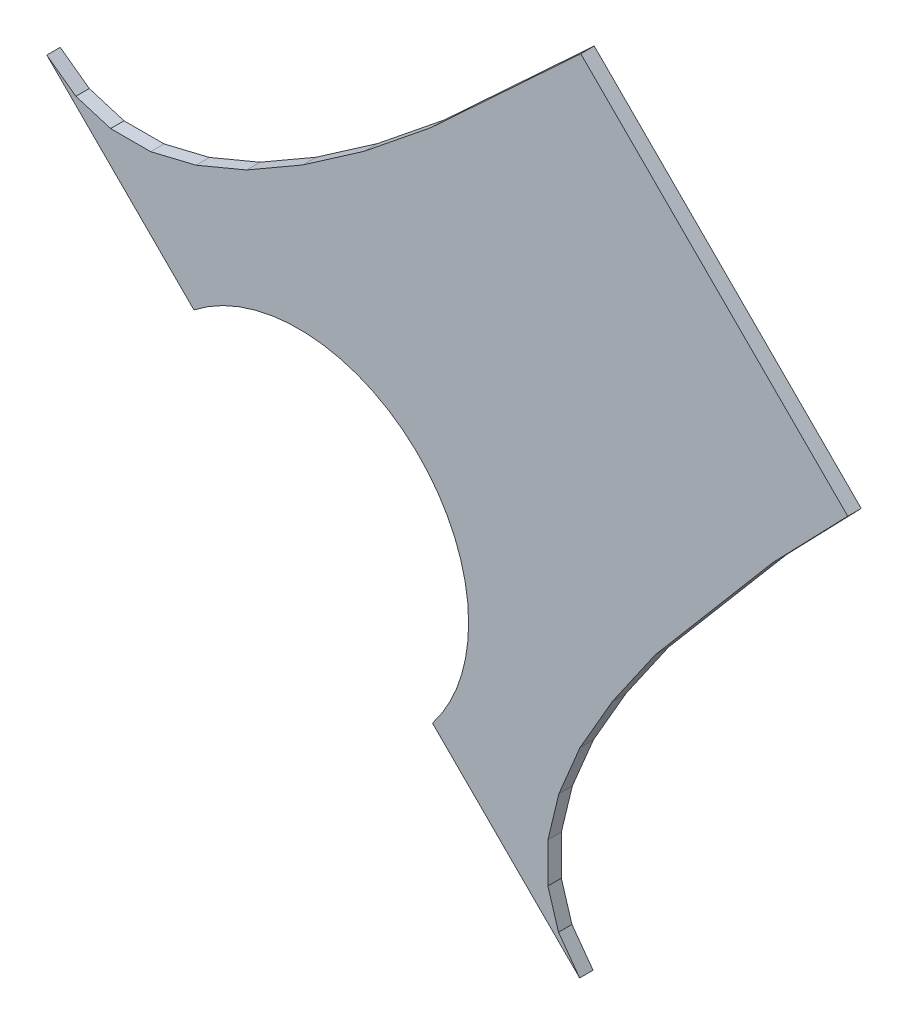
ISO-10303-21;
HEADER;
FILE_DESCRIPTION(('STEP AP214'),'2;1');
FILE_NAME('part.step','',(''),(''),'','','');
FILE_SCHEMA(('AUTOMOTIVE_DESIGN { 1 0 10303 214 1 1 1 1 }'));
ENDSEC;
DATA;
#1=APPLICATION_CONTEXT('core data for automotive mechanical design processes');
#2=APPLICATION_PROTOCOL_DEFINITION('international standard','automotive_design',2000,#1);
#3=PRODUCT_CONTEXT('',#1,'mechanical');
#4=PRODUCT('Part','Part','',(#3));
#5=PRODUCT_RELATED_PRODUCT_CATEGORY('part','',(#4));
#6=PRODUCT_DEFINITION_FORMATION('','',#4);
#7=PRODUCT_DEFINITION_CONTEXT('part definition',#1,'design');
#8=PRODUCT_DEFINITION('design','',#6,#7);
#9=PRODUCT_DEFINITION_SHAPE('','',#8);
#10=(LENGTH_UNIT() NAMED_UNIT(*) SI_UNIT(.MILLI.,.METRE.));
#11=(NAMED_UNIT(*) PLANE_ANGLE_UNIT() SI_UNIT($,.RADIAN.));
#12=(NAMED_UNIT(*) SI_UNIT($,.STERADIAN.) SOLID_ANGLE_UNIT());
#13=UNCERTAINTY_MEASURE_WITH_UNIT(LENGTH_MEASURE(1.E-05),#10,'distance_accuracy_value','');
#14=(GEOMETRIC_REPRESENTATION_CONTEXT(3) GLOBAL_UNCERTAINTY_ASSIGNED_CONTEXT((#13)) GLOBAL_UNIT_ASSIGNED_CONTEXT((#10,
#11,#12)) REPRESENTATION_CONTEXT('',''));
#15=CARTESIAN_POINT('',(0.,0.,0.));
#16=DIRECTION('',(0.,0.,1.));
#17=DIRECTION('',(1.,0.,0.));
#18=AXIS2_PLACEMENT_3D('',#15,#16,#17);
#19=CARTESIAN_POINT('',(89.3539962768555,46.8269996643066,0.));
#20=DIRECTION('',(-0.707110596466303,-0.707102965886206,0.));
#21=DIRECTION('',(-0.707102965886206,0.707110596466303,0.));
#22=AXIS2_PLACEMENT_3D('',#19,#20,#21);
#23=PLANE('',#22);
#24=DIRECTION('',(-0.707102965886206,0.707110596466303,0.));
#25=VECTOR('',#24,1.);
#26=CARTESIAN_POINT('',(89.3539962768555,46.8269996643066,0.03556));
#27=LINE('',#26,#25);
#28=CARTESIAN_POINT('',(89.3539962768555,46.8269996643066,0.03556));
#29=VERTEX_POINT('',#28);
#30=CARTESIAN_POINT('',(88.6470031738281,47.5340003967285,0.03556));
#31=VERTEX_POINT('',#30);
#32=EDGE_CURVE('E11',#29,#31,#27,.T.);
#33=ORIENTED_EDGE('',*,*,#32,.F.);
#34=DIRECTION('',(0.,0.,1.));
#35=VECTOR('',#34,1.);
#36=CARTESIAN_POINT('',(89.3539962768555,46.8269996643066,0.));
#37=LINE('',#36,#35);
#38=CARTESIAN_POINT('',(89.3539962768555,46.8269996643066,0.));
#39=VERTEX_POINT('',#38);
#40=EDGE_CURVE('E24',#39,#29,#37,.T.);
#41=ORIENTED_EDGE('',*,*,#40,.F.);
#42=DIRECTION('',(-0.707102965886206,0.707110596466303,0.));
#43=VECTOR('',#42,1.);
#44=CARTESIAN_POINT('',(89.3539962768555,46.8269996643066,0.));
#45=LINE('',#44,#43);
#46=CARTESIAN_POINT('',(88.6470031738281,47.5340003967285,0.));
#47=VERTEX_POINT('',#46);
#48=EDGE_CURVE('E351',#39,#47,#45,.T.);
#49=ORIENTED_EDGE('',*,*,#48,.T.);
#50=DIRECTION('',(0.,0.,1.));
#51=VECTOR('',#50,1.);
#52=CARTESIAN_POINT('',(88.6470031738281,47.5340003967285,0.));
#53=LINE('',#52,#51);
#54=EDGE_CURVE('E37',#47,#31,#53,.T.);
#55=ORIENTED_EDGE('',*,*,#54,.T.);
#56=EDGE_LOOP('',(#33,#41,#49,#55));
#57=FACE_BOUND('',#56,.T.);
#58=ADVANCED_FACE('F17',(#57),#23,.F.);
#59=CARTESIAN_POINT('',(89.1559982299805,46.6220016479492,0.));
#60=DIRECTION('',(-0.719280600267428,0.69471966870021,0.));
#61=DIRECTION('',(0.69471966870021,0.719280600267428,0.));
#62=AXIS2_PLACEMENT_3D('',#59,#60,#61);
#63=PLANE('',#62);
#64=DIRECTION('',(0.69471966870021,0.719280600267428,0.));
#65=VECTOR('',#64,1.);
#66=CARTESIAN_POINT('',(89.1559982299805,46.6220016479492,0.03556));
#67=LINE('',#66,#65);
#68=CARTESIAN_POINT('',(89.1559982299805,46.6220016479492,0.03556));
#69=VERTEX_POINT('',#68);
#70=EDGE_CURVE('E347',#69,#29,#67,.T.);
#71=ORIENTED_EDGE('',*,*,#70,.F.);
#72=DIRECTION('',(0.,0.,1.));
#73=VECTOR('',#72,1.);
#74=CARTESIAN_POINT('',(89.1559982299805,46.6220016479492,0.));
#75=LINE('',#74,#73);
#76=CARTESIAN_POINT('',(89.1559982299805,46.6220016479492,0.));
#77=VERTEX_POINT('',#76);
#78=EDGE_CURVE('E345',#77,#69,#75,.T.);
#79=ORIENTED_EDGE('',*,*,#78,.F.);
#80=DIRECTION('',(0.69471966870021,0.719280600267428,0.));
#81=VECTOR('',#80,1.);
#82=CARTESIAN_POINT('',(89.1559982299805,46.6220016479492,0.));
#83=LINE('',#82,#81);
#84=EDGE_CURVE('E343',#77,#39,#83,.T.);
#85=ORIENTED_EDGE('',*,*,#84,.T.);
#86=ORIENTED_EDGE('',*,*,#40,.T.);
#87=EDGE_LOOP('',(#71,#79,#85,#86));
#88=FACE_BOUND('',#87,.T.);
#89=ADVANCED_FACE('F354',(#88),#63,.F.);
#90=CARTESIAN_POINT('',(88.8440017700195,46.2540016174316,0.));
#91=DIRECTION('',(-0.762760609233175,0.646680951476256,0.));
#92=DIRECTION('',(0.646680951476256,0.762760609233175,0.));
#93=AXIS2_PLACEMENT_3D('',#90,#91,#92);
#94=PLANE('',#93);
#95=DIRECTION('',(0.646680951476256,0.762760609233175,0.));
#96=VECTOR('',#95,1.);
#97=CARTESIAN_POINT('',(88.8440017700195,46.2540016174316,0.03556));
#98=LINE('',#97,#96);
#99=CARTESIAN_POINT('',(88.8440017700195,46.2540016174316,0.03556));
#100=VERTEX_POINT('',#99);
#101=EDGE_CURVE('E340',#100,#69,#98,.T.);
#102=ORIENTED_EDGE('',*,*,#101,.F.);
#103=DIRECTION('',(0.,0.,1.));
#104=VECTOR('',#103,1.);
#105=CARTESIAN_POINT('',(88.8440017700195,46.2540016174316,0.));
#106=LINE('',#105,#104);
#107=CARTESIAN_POINT('',(88.8440017700195,46.2540016174316,0.));
#108=VERTEX_POINT('',#107);
#109=EDGE_CURVE('E338',#108,#100,#106,.T.);
#110=ORIENTED_EDGE('',*,*,#109,.F.);
#111=DIRECTION('',(0.646680951476256,0.762760609233175,0.));
#112=VECTOR('',#111,1.);
#113=CARTESIAN_POINT('',(88.8440017700195,46.2540016174316,0.));
#114=LINE('',#113,#112);
#115=EDGE_CURVE('E335',#108,#77,#114,.T.);
#116=ORIENTED_EDGE('',*,*,#115,.T.);
#117=ORIENTED_EDGE('',*,*,#78,.T.);
#118=EDGE_LOOP('',(#102,#110,#116,#117));
#119=FACE_BOUND('',#118,.T.);
#120=ADVANCED_FACE('F357',(#119),#94,.F.);
#121=CARTESIAN_POINT('',(88.7310028076172,46.0909996032715,0.));
#122=DIRECTION('',(-0.821834753710062,0.569725932000924,0.));
#123=DIRECTION('',(0.569725932000924,0.821834753710062,0.));
#124=AXIS2_PLACEMENT_3D('',#121,#122,#123);
#125=PLANE('',#124);
#126=DIRECTION('',(0.569725932000924,0.821834753710062,0.));
#127=VECTOR('',#126,1.);
#128=CARTESIAN_POINT('',(88.7310028076172,46.0909996032715,0.03556));
#129=LINE('',#128,#127);
#130=CARTESIAN_POINT('',(88.7310028076172,46.0909996032715,0.03556));
#131=VERTEX_POINT('',#130);
#132=EDGE_CURVE('E332',#131,#100,#129,.T.);
#133=ORIENTED_EDGE('',*,*,#132,.F.);
#134=DIRECTION('',(0.,0.,1.));
#135=VECTOR('',#134,1.);
#136=CARTESIAN_POINT('',(88.7310028076172,46.0909996032715,0.));
#137=LINE('',#136,#135);
#138=CARTESIAN_POINT('',(88.7310028076172,46.0909996032715,0.));
#139=VERTEX_POINT('',#138);
#140=EDGE_CURVE('E330',#139,#131,#137,.T.);
#141=ORIENTED_EDGE('',*,*,#140,.F.);
#142=DIRECTION('',(0.569725932000924,0.821834753710062,0.));
#143=VECTOR('',#142,1.);
#144=CARTESIAN_POINT('',(88.7310028076172,46.0909996032715,0.));
#145=LINE('',#144,#143);
#146=EDGE_CURVE('E327',#139,#108,#145,.T.);
#147=ORIENTED_EDGE('',*,*,#146,.T.);
#148=ORIENTED_EDGE('',*,*,#109,.T.);
#149=EDGE_LOOP('',(#133,#141,#147,#148));
#150=FACE_BOUND('',#149,.T.);
#151=ADVANCED_FACE('F362',(#150),#125,.F.);
#152=CARTESIAN_POINT('',(88.6449966430664,45.9420013427734,0.));
#153=DIRECTION('',(-0.866070758637261,0.499921434860997,0.));
#154=DIRECTION('',(0.499921434860997,0.866070758637261,0.));
#155=AXIS2_PLACEMENT_3D('',#152,#153,#154);
#156=PLANE('',#155);
#157=DIRECTION('',(0.499921434860997,0.866070758637261,0.));
#158=VECTOR('',#157,1.);
#159=CARTESIAN_POINT('',(88.6449966430664,45.9420013427734,0.03556));
#160=LINE('',#159,#158);
#161=CARTESIAN_POINT('',(88.6449966430664,45.9420013427734,0.03556));
#162=VERTEX_POINT('',#161);
#163=EDGE_CURVE('E324',#162,#131,#160,.T.);
#164=ORIENTED_EDGE('',*,*,#163,.F.);
#165=DIRECTION('',(0.,0.,1.));
#166=VECTOR('',#165,1.);
#167=CARTESIAN_POINT('',(88.6449966430664,45.9420013427734,0.));
#168=LINE('',#167,#166);
#169=CARTESIAN_POINT('',(88.6449966430664,45.9420013427734,0.));
#170=VERTEX_POINT('',#169);
#171=EDGE_CURVE('E322',#170,#162,#168,.T.);
#172=ORIENTED_EDGE('',*,*,#171,.F.);
#173=DIRECTION('',(0.499921434860997,0.866070758637261,0.));
#174=VECTOR('',#173,1.);
#175=CARTESIAN_POINT('',(88.6449966430664,45.9420013427734,0.));
#176=LINE('',#175,#174);
#177=EDGE_CURVE('E319',#170,#139,#176,.T.);
#178=ORIENTED_EDGE('',*,*,#177,.T.);
#179=ORIENTED_EDGE('',*,*,#140,.T.);
#180=EDGE_LOOP('',(#164,#172,#178,#179));
#181=FACE_BOUND('',#180,.T.);
#182=ADVANCED_FACE('F365',(#181),#156,.F.);
#183=CARTESIAN_POINT('',(88.588996887207,45.8079986572266,0.));
#184=DIRECTION('',(-0.922672321182495,0.385584994163033,0.));
#185=DIRECTION('',(0.385584994163033,0.922672321182495,0.));
#186=AXIS2_PLACEMENT_3D('',#183,#184,#185);
#187=PLANE('',#186);
#188=DIRECTION('',(0.385584994163033,0.922672321182495,0.));
#189=VECTOR('',#188,1.);
#190=CARTESIAN_POINT('',(88.588996887207,45.8079986572266,0.03556));
#191=LINE('',#190,#189);
#192=CARTESIAN_POINT('',(88.588996887207,45.8079986572266,0.03556));
#193=VERTEX_POINT('',#192);
#194=EDGE_CURVE('E316',#193,#162,#191,.T.);
#195=ORIENTED_EDGE('',*,*,#194,.F.);
#196=DIRECTION('',(0.,0.,1.));
#197=VECTOR('',#196,1.);
#198=CARTESIAN_POINT('',(88.588996887207,45.8079986572266,0.));
#199=LINE('',#198,#197);
#200=CARTESIAN_POINT('',(88.588996887207,45.8079986572266,0.));
#201=VERTEX_POINT('',#200);
#202=EDGE_CURVE('E314',#201,#193,#199,.T.);
#203=ORIENTED_EDGE('',*,*,#202,.F.);
#204=DIRECTION('',(0.385584994163033,0.922672321182495,0.));
#205=VECTOR('',#204,1.);
#206=CARTESIAN_POINT('',(88.588996887207,45.8079986572266,0.));
#207=LINE('',#206,#205);
#208=EDGE_CURVE('E311',#201,#170,#207,.T.);
#209=ORIENTED_EDGE('',*,*,#208,.T.);
#210=ORIENTED_EDGE('',*,*,#171,.T.);
#211=EDGE_LOOP('',(#195,#203,#209,#210));
#212=FACE_BOUND('',#211,.T.);
#213=ADVANCED_FACE('F370',(#212),#187,.F.);
#214=CARTESIAN_POINT('',(88.5599975585938,45.6879997253418,0.));
#215=DIRECTION('',(-0.972019227998913,0.23490129927354,0.));
#216=DIRECTION('',(0.23490129927354,0.972019227998913,0.));
#217=AXIS2_PLACEMENT_3D('',#214,#215,#216);
#218=PLANE('',#217);
#219=DIRECTION('',(0.23490129927354,0.972019227998913,0.));
#220=VECTOR('',#219,1.);
#221=CARTESIAN_POINT('',(88.5599975585938,45.6879997253418,0.03556));
#222=LINE('',#221,#220);
#223=CARTESIAN_POINT('',(88.5599975585938,45.6879997253418,0.03556));
#224=VERTEX_POINT('',#223);
#225=EDGE_CURVE('E308',#224,#193,#222,.T.);
#226=ORIENTED_EDGE('',*,*,#225,.F.);
#227=DIRECTION('',(0.,0.,1.));
#228=VECTOR('',#227,1.);
#229=CARTESIAN_POINT('',(88.5599975585938,45.6879997253418,0.));
#230=LINE('',#229,#228);
#231=CARTESIAN_POINT('',(88.5599975585938,45.6879997253418,0.));
#232=VERTEX_POINT('',#231);
#233=EDGE_CURVE('E306',#232,#224,#230,.T.);
#234=ORIENTED_EDGE('',*,*,#233,.F.);
#235=DIRECTION('',(0.23490129927354,0.972019227998913,0.));
#236=VECTOR('',#235,1.);
#237=CARTESIAN_POINT('',(88.5599975585938,45.6879997253418,0.));
#238=LINE('',#237,#236);
#239=EDGE_CURVE('E303',#232,#201,#238,.T.);
#240=ORIENTED_EDGE('',*,*,#239,.T.);
#241=ORIENTED_EDGE('',*,*,#202,.T.);
#242=EDGE_LOOP('',(#226,#234,#240,#241));
#243=FACE_BOUND('',#242,.T.);
#244=ADVANCED_FACE('F373',(#243),#218,.F.);
#245=CARTESIAN_POINT('',(88.5599975585938,45.5820007324219,0.));
#246=DIRECTION('',(-1.,0.,0.));
#247=DIRECTION('',(0.,1.,0.));
#248=AXIS2_PLACEMENT_3D('',#245,#246,#247);
#249=PLANE('',#248);
#250=DIRECTION('',(0.,1.,0.));
#251=VECTOR('',#250,1.);
#252=CARTESIAN_POINT('',(88.5599975585938,45.5820007324219,0.03556));
#253=LINE('',#252,#251);
#254=CARTESIAN_POINT('',(88.5599975585938,45.5820007324219,0.03556));
#255=VERTEX_POINT('',#254);
#256=EDGE_CURVE('E300',#255,#224,#253,.T.);
#257=ORIENTED_EDGE('',*,*,#256,.F.);
#258=DIRECTION('',(0.,0.,1.));
#259=VECTOR('',#258,1.);
#260=CARTESIAN_POINT('',(88.5599975585938,45.5820007324219,0.));
#261=LINE('',#260,#259);
#262=CARTESIAN_POINT('',(88.5599975585938,45.5820007324219,0.));
#263=VERTEX_POINT('',#262);
#264=EDGE_CURVE('E298',#263,#255,#261,.T.);
#265=ORIENTED_EDGE('',*,*,#264,.F.);
#266=DIRECTION('',(0.,1.,0.));
#267=VECTOR('',#266,1.);
#268=CARTESIAN_POINT('',(88.5599975585938,45.5820007324219,0.));
#269=LINE('',#268,#267);
#270=EDGE_CURVE('E295',#263,#232,#269,.T.);
#271=ORIENTED_EDGE('',*,*,#270,.T.);
#272=ORIENTED_EDGE('',*,*,#233,.T.);
#273=EDGE_LOOP('',(#257,#265,#271,#272));
#274=FACE_BOUND('',#273,.T.);
#275=ADVANCED_FACE('F378',(#274),#249,.F.);
#276=CARTESIAN_POINT('',(88.5879974365234,45.4900016784668,0.));
#277=DIRECTION('',(-0.956673400019129,-0.291163194267131,0.));
#278=DIRECTION('',(-0.291163194267131,0.956673400019129,0.));
#279=AXIS2_PLACEMENT_3D('',#276,#277,#278);
#280=PLANE('',#279);
#281=DIRECTION('',(-0.291163194267131,0.956673400019129,0.));
#282=VECTOR('',#281,1.);
#283=CARTESIAN_POINT('',(88.5879974365234,45.4900016784668,0.03556));
#284=LINE('',#283,#282);
#285=CARTESIAN_POINT('',(88.5879974365234,45.4900016784668,0.03556));
#286=VERTEX_POINT('',#285);
#287=EDGE_CURVE('E292',#286,#255,#284,.T.);
#288=ORIENTED_EDGE('',*,*,#287,.F.);
#289=DIRECTION('',(0.,0.,1.));
#290=VECTOR('',#289,1.);
#291=CARTESIAN_POINT('',(88.5879974365234,45.4900016784668,0.));
#292=LINE('',#291,#290);
#293=CARTESIAN_POINT('',(88.5879974365234,45.4900016784668,0.));
#294=VERTEX_POINT('',#293);
#295=EDGE_CURVE('E290',#294,#286,#292,.T.);
#296=ORIENTED_EDGE('',*,*,#295,.F.);
#297=DIRECTION('',(-0.291163194267131,0.956673400019129,0.));
#298=VECTOR('',#297,1.);
#299=CARTESIAN_POINT('',(88.5879974365234,45.4900016784668,0.));
#300=LINE('',#299,#298);
#301=EDGE_CURVE('E287',#294,#263,#300,.T.);
#302=ORIENTED_EDGE('',*,*,#301,.T.);
#303=ORIENTED_EDGE('',*,*,#264,.T.);
#304=EDGE_LOOP('',(#288,#296,#302,#303));
#305=FACE_BOUND('',#304,.T.);
#306=ADVANCED_FACE('F381',(#305),#280,.F.);
#307=CARTESIAN_POINT('',(88.6439971923828,45.4129981994629,0.));
#308=DIRECTION('',(-0.808749944366191,-0.588152639616352,0.));
#309=DIRECTION('',(-0.588152639616352,0.808749944366191,0.));
#310=AXIS2_PLACEMENT_3D('',#307,#308,#309);
#311=PLANE('',#310);
#312=DIRECTION('',(-0.588152639616352,0.808749944366191,0.));
#313=VECTOR('',#312,1.);
#314=CARTESIAN_POINT('',(88.6439971923828,45.4129981994629,0.03556));
#315=LINE('',#314,#313);
#316=CARTESIAN_POINT('',(88.6439971923828,45.4129981994629,0.03556));
#317=VERTEX_POINT('',#316);
#318=EDGE_CURVE('E284',#317,#286,#315,.T.);
#319=ORIENTED_EDGE('',*,*,#318,.F.);
#320=DIRECTION('',(0.,0.,1.));
#321=VECTOR('',#320,1.);
#322=CARTESIAN_POINT('',(88.6439971923828,45.4129981994629,0.));
#323=LINE('',#322,#321);
#324=CARTESIAN_POINT('',(88.6439971923828,45.4129981994629,0.));
#325=VERTEX_POINT('',#324);
#326=EDGE_CURVE('E282',#325,#317,#323,.T.);
#327=ORIENTED_EDGE('',*,*,#326,.F.);
#328=DIRECTION('',(-0.588152639616352,0.808749944366191,0.));
#329=VECTOR('',#328,1.);
#330=CARTESIAN_POINT('',(88.6439971923828,45.4129981994629,0.));
#331=LINE('',#330,#329);
#332=EDGE_CURVE('E279',#325,#294,#331,.T.);
#333=ORIENTED_EDGE('',*,*,#332,.T.);
#334=ORIENTED_EDGE('',*,*,#295,.T.);
#335=EDGE_LOOP('',(#319,#327,#333,#334));
#336=FACE_BOUND('',#335,.T.);
#337=ADVANCED_FACE('F386',(#336),#311,.F.);
#338=CARTESIAN_POINT('',(88.2543511099184,45.8026463887829,0.));
#339=DIRECTION('',(0.707108692877547,0.70710486949038,0.));
#340=DIRECTION('',(0.70710486949038,-0.707108692877547,0.));
#341=AXIS2_PLACEMENT_3D('',#338,#339,#340);
#342=PLANE('',#341);
#343=DIRECTION('',(0.70710486949038,-0.707108692877547,0.));
#344=VECTOR('',#343,1.);
#345=CARTESIAN_POINT('',(87.2330017089844,46.8240013122559,0.03556));
#346=LINE('',#345,#344);
#347=CARTESIAN_POINT('',(88.2543511099184,45.8026463887829,0.03556));
#348=VERTEX_POINT('',#347);
#349=EDGE_CURVE('E276',#348,#317,#346,.T.);
#350=ORIENTED_EDGE('',*,*,#349,.F.);
#351=DIRECTION('',(0.,0.,1.));
#352=VECTOR('',#351,1.);
#353=CARTESIAN_POINT('',(88.2543511099184,45.8026463887829,0.));
#354=LINE('',#353,#352);
#355=CARTESIAN_POINT('',(88.2543511099184,45.8026463887829,0.));
#356=VERTEX_POINT('',#355);
#357=EDGE_CURVE('E274',#356,#348,#354,.T.);
#358=ORIENTED_EDGE('',*,*,#357,.F.);
#359=DIRECTION('',(0.70710486949038,-0.707108692877547,0.));
#360=VECTOR('',#359,1.);
#361=CARTESIAN_POINT('',(87.2330017089844,46.8240013122559,0.));
#362=LINE('',#361,#360);
#363=EDGE_CURVE('E271',#356,#325,#362,.T.);
#364=ORIENTED_EDGE('',*,*,#363,.T.);
#365=ORIENTED_EDGE('',*,*,#326,.T.);
#366=EDGE_LOOP('',(#350,#358,#364,#365));
#367=FACE_BOUND('',#366,.T.);
#368=ADVANCED_FACE('F389',(#367),#342,.F.);
#369=CARTESIAN_POINT('',(87.900002,46.0800196,0.));
#370=DIRECTION('',(0.,0.,-1.));
#371=DIRECTION('',(1.,0.,0.));
#372=AXIS2_PLACEMENT_3D('',#369,#370,#371);
#373=CYLINDRICAL_SURFACE('',#372,0.4499991);
#374=ORIENTED_EDGE('',*,*,#357,.T.);
#375=CARTESIAN_POINT('',(87.900002,46.0800196,0.03556));
#376=DIRECTION('',(0.,0.,1.));
#377=DIRECTION('',(1.,0.,0.));
#378=AXIS2_PLACEMENT_3D('',#375,#376,#377);
#379=CIRCLE('',#378,0.4499991);
#380=CARTESIAN_POINT('',(88.3500011,46.0800196,0.03556));
#381=VERTEX_POINT('',#380);
#382=EDGE_CURVE('E268',#348,#381,#379,.T.);
#383=ORIENTED_EDGE('',*,*,#382,.T.);
#384=DIRECTION('',(0.,0.,1.));
#385=VECTOR('',#384,1.);
#386=CARTESIAN_POINT('',(88.3500011,46.0800196,0.));
#387=LINE('',#386,#385);
#388=CARTESIAN_POINT('',(88.3500011,46.0800196,0.));
#389=VERTEX_POINT('',#388);
#390=EDGE_CURVE('E266',#389,#381,#387,.T.);
#391=ORIENTED_EDGE('',*,*,#390,.F.);
#392=CARTESIAN_POINT('',(87.900002,46.0800196,0.));
#393=DIRECTION('',(0.,0.,1.));
#394=DIRECTION('',(1.,0.,0.));
#395=AXIS2_PLACEMENT_3D('',#392,#393,#394);
#396=CIRCLE('',#395,0.4499991);
#397=EDGE_CURVE('E263',#356,#389,#396,.T.);
#398=ORIENTED_EDGE('',*,*,#397,.F.);
#399=EDGE_LOOP('',(#374,#383,#391,#398));
#400=FACE_BOUND('',#399,.T.);
#401=ADVANCED_FACE('F395',(#400),#373,.F.);
#402=CARTESIAN_POINT('',(87.900002,46.0800196,0.));
#403=DIRECTION('',(0.,0.,-1.));
#404=DIRECTION('',(1.,0.,0.));
#405=AXIS2_PLACEMENT_3D('',#402,#403,#404);
#406=CYLINDRICAL_SURFACE('',#405,0.4499991);
#407=ORIENTED_EDGE('',*,*,#390,.T.);
#408=CARTESIAN_POINT('',(87.900002,46.0800196,0.03556));
#409=DIRECTION('',(0.,0.,1.));
#410=DIRECTION('',(1.,0.,0.));
#411=AXIS2_PLACEMENT_3D('',#408,#409,#410);
#412=CIRCLE('',#411,0.4499991);
#413=CARTESIAN_POINT('',(87.6226307047831,46.434370209694,0.03556));
#414=VERTEX_POINT('',#413);
#415=EDGE_CURVE('E260',#381,#414,#412,.T.);
#416=ORIENTED_EDGE('',*,*,#415,.T.);
#417=DIRECTION('',(0.,0.,1.));
#418=VECTOR('',#417,1.);
#419=CARTESIAN_POINT('',(87.6226307047831,46.434370209694,0.));
#420=LINE('',#419,#418);
#421=CARTESIAN_POINT('',(87.6226307047831,46.434370209694,0.));
#422=VERTEX_POINT('',#421);
#423=EDGE_CURVE('E258',#422,#414,#420,.T.);
#424=ORIENTED_EDGE('',*,*,#423,.F.);
#425=EDGE_CURVE('E257',#389,#422,#396,.T.);
#426=ORIENTED_EDGE('',*,*,#425,.F.);
#427=EDGE_LOOP('',(#407,#416,#424,#426));
#428=FACE_BOUND('',#427,.T.);
#429=ADVANCED_FACE('F398',(#428),#406,.F.);
#430=CARTESIAN_POINT('',(87.2330017089844,46.8240013122559,0.));
#431=DIRECTION('',(0.707108692877547,0.70710486949038,0.));
#432=DIRECTION('',(0.70710486949038,-0.707108692877547,0.));
#433=AXIS2_PLACEMENT_3D('',#430,#431,#432);
#434=PLANE('',#433);
#435=DIRECTION('',(0.70710486949038,-0.707108692877547,0.));
#436=VECTOR('',#435,1.);
#437=CARTESIAN_POINT('',(87.2330017089844,46.8240013122559,0.03556));
#438=LINE('',#437,#436);
#439=CARTESIAN_POINT('',(87.2330017089844,46.8240013122559,0.03556));
#440=VERTEX_POINT('',#439);
#441=EDGE_CURVE('E254',#440,#414,#438,.T.);
#442=ORIENTED_EDGE('',*,*,#441,.F.);
#443=DIRECTION('',(0.,0.,1.));
#444=VECTOR('',#443,1.);
#445=CARTESIAN_POINT('',(87.2330017089844,46.8240013122559,0.));
#446=LINE('',#445,#444);
#447=CARTESIAN_POINT('',(87.2330017089844,46.8240013122559,0.));
#448=VERTEX_POINT('',#447);
#449=EDGE_CURVE('E252',#448,#440,#446,.T.);
#450=ORIENTED_EDGE('',*,*,#449,.F.);
#451=EDGE_CURVE('E251',#448,#422,#362,.T.);
#452=ORIENTED_EDGE('',*,*,#451,.T.);
#453=ORIENTED_EDGE('',*,*,#423,.T.);
#454=EDGE_LOOP('',(#442,#450,#452,#453));
#455=FACE_BOUND('',#454,.T.);
#456=ADVANCED_FACE('F404',(#455),#434,.F.);
#457=CARTESIAN_POINT('',(87.3099975585938,46.7680015563965,0.));
#458=DIRECTION('',(-0.588190756642206,-0.808722222892799,0.));
#459=DIRECTION('',(-0.808722222892799,0.588190756642206,0.));
#460=AXIS2_PLACEMENT_3D('',#457,#458,#459);
#461=PLANE('',#460);
#462=DIRECTION('',(-0.808722222892799,0.588190756642206,0.));
#463=VECTOR('',#462,1.);
#464=CARTESIAN_POINT('',(87.3099975585938,46.7680015563965,0.03556));
#465=LINE('',#464,#463);
#466=CARTESIAN_POINT('',(87.3099975585938,46.7680015563965,0.03556));
#467=VERTEX_POINT('',#466);
#468=EDGE_CURVE('E248',#467,#440,#465,.T.);
#469=ORIENTED_EDGE('',*,*,#468,.F.);
#470=DIRECTION('',(0.,0.,1.));
#471=VECTOR('',#470,1.);
#472=CARTESIAN_POINT('',(87.3099975585938,46.7680015563965,0.));
#473=LINE('',#472,#471);
#474=CARTESIAN_POINT('',(87.3099975585938,46.7680015563965,0.));
#475=VERTEX_POINT('',#474);
#476=EDGE_CURVE('E246',#475,#467,#473,.T.);
#477=ORIENTED_EDGE('',*,*,#476,.F.);
#478=DIRECTION('',(-0.808722222892799,0.588190756642206,0.));
#479=VECTOR('',#478,1.);
#480=CARTESIAN_POINT('',(87.3099975585938,46.7680015563965,0.));
#481=LINE('',#480,#479);
#482=EDGE_CURVE('E243',#475,#448,#481,.T.);
#483=ORIENTED_EDGE('',*,*,#482,.T.);
#484=ORIENTED_EDGE('',*,*,#449,.T.);
#485=EDGE_LOOP('',(#469,#477,#483,#484));
#486=FACE_BOUND('',#485,.T.);
#487=ADVANCED_FACE('F407',(#486),#461,.F.);
#488=CARTESIAN_POINT('',(87.4020004272461,46.7400016784668,0.));
#489=DIRECTION('',(-0.291152145218841,-0.956676762723161,0.));
#490=DIRECTION('',(-0.956676762723161,0.291152145218841,0.));
#491=AXIS2_PLACEMENT_3D('',#488,#489,#490);
#492=PLANE('',#491);
#493=DIRECTION('',(-0.956676762723161,0.291152145218841,0.));
#494=VECTOR('',#493,1.);
#495=CARTESIAN_POINT('',(87.4020004272461,46.7400016784668,0.03556));
#496=LINE('',#495,#494);
#497=CARTESIAN_POINT('',(87.4020004272461,46.7400016784668,0.03556));
#498=VERTEX_POINT('',#497);
#499=EDGE_CURVE('E240',#498,#467,#496,.T.);
#500=ORIENTED_EDGE('',*,*,#499,.F.);
#501=DIRECTION('',(0.,0.,1.));
#502=VECTOR('',#501,1.);
#503=CARTESIAN_POINT('',(87.4020004272461,46.7400016784668,0.));
#504=LINE('',#503,#502);
#505=CARTESIAN_POINT('',(87.4020004272461,46.7400016784668,0.));
#506=VERTEX_POINT('',#505);
#507=EDGE_CURVE('E238',#506,#498,#504,.T.);
#508=ORIENTED_EDGE('',*,*,#507,.F.);
#509=DIRECTION('',(-0.956676762723161,0.291152145218841,0.));
#510=VECTOR('',#509,1.);
#511=CARTESIAN_POINT('',(87.4020004272461,46.7400016784668,0.));
#512=LINE('',#511,#510);
#513=EDGE_CURVE('E235',#506,#475,#512,.T.);
#514=ORIENTED_EDGE('',*,*,#513,.T.);
#515=ORIENTED_EDGE('',*,*,#476,.T.);
#516=EDGE_LOOP('',(#500,#508,#514,#515));
#517=FACE_BOUND('',#516,.T.);
#518=ADVANCED_FACE('F412',(#517),#492,.F.);
#519=CARTESIAN_POINT('',(87.5080032348633,46.7400016784668,0.));
#520=DIRECTION('',(0.,-1.,0.));
#521=DIRECTION('',(-1.,0.,0.));
#522=AXIS2_PLACEMENT_3D('',#519,#520,#521);
#523=PLANE('',#522);
#524=DIRECTION('',(-1.,0.,0.));
#525=VECTOR('',#524,1.);
#526=CARTESIAN_POINT('',(87.5080032348633,46.7400016784668,0.03556));
#527=LINE('',#526,#525);
#528=CARTESIAN_POINT('',(87.5080032348633,46.7400016784668,0.03556));
#529=VERTEX_POINT('',#528);
#530=EDGE_CURVE('E232',#529,#498,#527,.T.);
#531=ORIENTED_EDGE('',*,*,#530,.F.);
#532=DIRECTION('',(0.,0.,1.));
#533=VECTOR('',#532,1.);
#534=CARTESIAN_POINT('',(87.5080032348633,46.7400016784668,0.));
#535=LINE('',#534,#533);
#536=CARTESIAN_POINT('',(87.5080032348633,46.7400016784668,0.));
#537=VERTEX_POINT('',#536);
#538=EDGE_CURVE('E230',#537,#529,#535,.T.);
#539=ORIENTED_EDGE('',*,*,#538,.F.);
#540=DIRECTION('',(-1.,0.,0.));
#541=VECTOR('',#540,1.);
#542=CARTESIAN_POINT('',(87.5080032348633,46.7400016784668,0.));
#543=LINE('',#542,#541);
#544=EDGE_CURVE('E227',#537,#506,#543,.T.);
#545=ORIENTED_EDGE('',*,*,#544,.T.);
#546=ORIENTED_EDGE('',*,*,#507,.T.);
#547=EDGE_LOOP('',(#531,#539,#545,#546));
#548=FACE_BOUND('',#547,.T.);
#549=ADVANCED_FACE('F415',(#548),#523,.F.);
#550=CARTESIAN_POINT('',(87.6279983520508,46.7690010070801,0.));
#551=DIRECTION('',(0.234908354817336,-0.972017522906358,0.));
#552=DIRECTION('',(-0.972017522906358,-0.234908354817336,0.));
#553=AXIS2_PLACEMENT_3D('',#550,#551,#552);
#554=PLANE('',#553);
#555=DIRECTION('',(-0.972017522906358,-0.234908354817336,0.));
#556=VECTOR('',#555,1.);
#557=CARTESIAN_POINT('',(87.6279983520508,46.7690010070801,0.03556));
#558=LINE('',#557,#556);
#559=CARTESIAN_POINT('',(87.6279983520508,46.7690010070801,0.03556));
#560=VERTEX_POINT('',#559);
#561=EDGE_CURVE('E224',#560,#529,#558,.T.);
#562=ORIENTED_EDGE('',*,*,#561,.F.);
#563=DIRECTION('',(0.,0.,1.));
#564=VECTOR('',#563,1.);
#565=CARTESIAN_POINT('',(87.6279983520508,46.7690010070801,0.));
#566=LINE('',#565,#564);
#567=CARTESIAN_POINT('',(87.6279983520508,46.7690010070801,0.));
#568=VERTEX_POINT('',#567);
#569=EDGE_CURVE('E222',#568,#560,#566,.T.);
#570=ORIENTED_EDGE('',*,*,#569,.F.);
#571=DIRECTION('',(-0.972017522906358,-0.234908354817336,0.));
#572=VECTOR('',#571,1.);
#573=CARTESIAN_POINT('',(87.6279983520508,46.7690010070801,0.));
#574=LINE('',#573,#572);
#575=EDGE_CURVE('E219',#568,#537,#574,.T.);
#576=ORIENTED_EDGE('',*,*,#575,.T.);
#577=ORIENTED_EDGE('',*,*,#538,.T.);
#578=EDGE_LOOP('',(#562,#570,#576,#577));
#579=FACE_BOUND('',#578,.T.);
#580=ADVANCED_FACE('F420',(#579),#554,.F.);
#581=CARTESIAN_POINT('',(87.7620010375977,46.8250007629395,0.));
#582=DIRECTION('',(0.385584994163033,-0.922672321182495,0.));
#583=DIRECTION('',(-0.922672321182495,-0.385584994163033,0.));
#584=AXIS2_PLACEMENT_3D('',#581,#582,#583);
#585=PLANE('',#584);
#586=DIRECTION('',(-0.922672321182495,-0.385584994163033,0.));
#587=VECTOR('',#586,1.);
#588=CARTESIAN_POINT('',(87.7620010375977,46.8250007629395,0.03556));
#589=LINE('',#588,#587);
#590=CARTESIAN_POINT('',(87.7620010375977,46.8250007629395,0.03556));
#591=VERTEX_POINT('',#590);
#592=EDGE_CURVE('E216',#591,#560,#589,.T.);
#593=ORIENTED_EDGE('',*,*,#592,.F.);
#594=DIRECTION('',(0.,0.,1.));
#595=VECTOR('',#594,1.);
#596=CARTESIAN_POINT('',(87.7620010375977,46.8250007629395,0.));
#597=LINE('',#596,#595);
#598=CARTESIAN_POINT('',(87.7620010375977,46.8250007629395,0.));
#599=VERTEX_POINT('',#598);
#600=EDGE_CURVE('E214',#599,#591,#597,.T.);
#601=ORIENTED_EDGE('',*,*,#600,.F.);
#602=DIRECTION('',(-0.922672321182495,-0.385584994163033,0.));
#603=VECTOR('',#602,1.);
#604=CARTESIAN_POINT('',(87.7620010375977,46.8250007629395,0.));
#605=LINE('',#604,#603);
#606=EDGE_CURVE('E211',#599,#568,#605,.T.);
#607=ORIENTED_EDGE('',*,*,#606,.T.);
#608=ORIENTED_EDGE('',*,*,#569,.T.);
#609=EDGE_LOOP('',(#593,#601,#607,#608));
#610=FACE_BOUND('',#609,.T.);
#611=ADVANCED_FACE('F423',(#610),#585,.F.);
#612=CARTESIAN_POINT('',(87.911003112793,46.9109992980957,0.));
#613=DIRECTION('',(0.499878570183412,-0.866095499971792,0.));
#614=DIRECTION('',(-0.866095499971792,-0.499878570183412,0.));
#615=AXIS2_PLACEMENT_3D('',#612,#613,#614);
#616=PLANE('',#615);
#617=DIRECTION('',(-0.866095499971792,-0.499878570183412,0.));
#618=VECTOR('',#617,1.);
#619=CARTESIAN_POINT('',(87.911003112793,46.9109992980957,0.03556));
#620=LINE('',#619,#618);
#621=CARTESIAN_POINT('',(87.911003112793,46.9109992980957,0.03556));
#622=VERTEX_POINT('',#621);
#623=EDGE_CURVE('E208',#622,#591,#620,.T.);
#624=ORIENTED_EDGE('',*,*,#623,.F.);
#625=DIRECTION('',(0.,0.,1.));
#626=VECTOR('',#625,1.);
#627=CARTESIAN_POINT('',(87.911003112793,46.9109992980957,0.));
#628=LINE('',#627,#626);
#629=CARTESIAN_POINT('',(87.911003112793,46.9109992980957,0.));
#630=VERTEX_POINT('',#629);
#631=EDGE_CURVE('E206',#630,#622,#628,.T.);
#632=ORIENTED_EDGE('',*,*,#631,.F.);
#633=DIRECTION('',(-0.866095499971792,-0.499878570183412,0.));
#634=VECTOR('',#633,1.);
#635=CARTESIAN_POINT('',(87.911003112793,46.9109992980957,0.));
#636=LINE('',#635,#634);
#637=EDGE_CURVE('E203',#630,#599,#636,.T.);
#638=ORIENTED_EDGE('',*,*,#637,.T.);
#639=ORIENTED_EDGE('',*,*,#600,.T.);
#640=EDGE_LOOP('',(#624,#632,#638,#639));
#641=FACE_BOUND('',#640,.T.);
#642=ADVANCED_FACE('F426',(#641),#616,.F.);
#643=CARTESIAN_POINT('',(88.0739974975586,47.0239982604981,0.));
#644=DIRECTION('',(0.569743943195841,-0.821822267398282,0.));
#645=DIRECTION('',(-0.821822267398282,-0.569743943195841,0.));
#646=AXIS2_PLACEMENT_3D('',#643,#644,#645);
#647=PLANE('',#646);
#648=DIRECTION('',(-0.821822267398282,-0.569743943195841,0.));
#649=VECTOR('',#648,1.);
#650=CARTESIAN_POINT('',(88.0739974975586,47.023998260498,0.03556));
#651=LINE('',#650,#649);
#652=CARTESIAN_POINT('',(88.0739974975586,47.023998260498,0.03556));
#653=VERTEX_POINT('',#652);
#654=EDGE_CURVE('E200',#653,#622,#651,.T.);
#655=ORIENTED_EDGE('',*,*,#654,.F.);
#656=DIRECTION('',(0.,0.,1.));
#657=VECTOR('',#656,1.);
#658=CARTESIAN_POINT('',(88.0739974975586,47.023998260498,0.));
#659=LINE('',#658,#657);
#660=CARTESIAN_POINT('',(88.0739974975586,47.023998260498,0.));
#661=VERTEX_POINT('',#660);
#662=EDGE_CURVE('E198',#661,#653,#659,.T.);
#663=ORIENTED_EDGE('',*,*,#662,.F.);
#664=DIRECTION('',(-0.821822267398282,-0.569743943195841,0.));
#665=VECTOR('',#664,1.);
#666=CARTESIAN_POINT('',(88.0739974975586,47.023998260498,0.));
#667=LINE('',#666,#665);
#668=EDGE_CURVE('E189',#661,#630,#667,.T.);
#669=ORIENTED_EDGE('',*,*,#668,.T.);
#670=ORIENTED_EDGE('',*,*,#631,.T.);
#671=EDGE_LOOP('',(#655,#663,#669,#670));
#672=FACE_BOUND('',#671,.T.);
#673=ADVANCED_FACE('F429',(#672),#647,.F.);
#674=CARTESIAN_POINT('',(88.25,47.1660003662109,0.));
#675=DIRECTION('',(0.627925533350276,-0.778273425324783,0.));
#676=DIRECTION('',(-0.778273425324783,-0.627925533350276,0.));
#677=AXIS2_PLACEMENT_3D('',#674,#675,#676);
#678=PLANE('',#677);
#679=DIRECTION('',(-0.778273425324783,-0.627925533350276,0.));
#680=VECTOR('',#679,1.);
#681=CARTESIAN_POINT('',(88.25,47.1660003662109,0.03556));
#682=LINE('',#681,#680);
#683=CARTESIAN_POINT('',(88.25,47.1660003662109,0.03556));
#684=VERTEX_POINT('',#683);
#685=EDGE_CURVE('E175',#684,#653,#682,.T.);
#686=ORIENTED_EDGE('',*,*,#685,.F.);
#687=DIRECTION('',(0.,0.,1.));
#688=VECTOR('',#687,1.);
#689=CARTESIAN_POINT('',(88.25,47.1660003662109,0.));
#690=LINE('',#689,#688);
#691=CARTESIAN_POINT('',(88.25,47.1660003662109,0.));
#692=VERTEX_POINT('',#691);
#693=EDGE_CURVE('E170',#692,#684,#690,.T.);
#694=ORIENTED_EDGE('',*,*,#693,.F.);
#695=DIRECTION('',(-0.778273425324783,-0.627925533350276,0.));
#696=VECTOR('',#695,1.);
#697=CARTESIAN_POINT('',(88.25,47.1660003662109,0.));
#698=LINE('',#697,#696);
#699=EDGE_CURVE('E173',#692,#661,#698,.T.);
#700=ORIENTED_EDGE('',*,*,#699,.T.);
#701=ORIENTED_EDGE('',*,*,#662,.T.);
#702=EDGE_LOOP('',(#686,#694,#700,#701));
#703=FACE_BOUND('',#702,.T.);
#704=ADVANCED_FACE('F172',(#703),#678,.F.);
#705=CARTESIAN_POINT('',(88.6470031738281,47.5340003967285,0.));
#706=DIRECTION('',(0.679810244514903,-0.733388049706693,0.));
#707=DIRECTION('',(-0.733388049706693,-0.679810244514903,0.));
#708=AXIS2_PLACEMENT_3D('',#705,#706,#707);
#709=PLANE('',#708);
#710=DIRECTION('',(-0.733388049706693,-0.679810244514903,0.));
#711=VECTOR('',#710,1.);
#712=CARTESIAN_POINT('',(88.6470031738281,47.5340003967285,0.03556));
#713=LINE('',#712,#711);
#714=EDGE_CURVE('E190',#31,#684,#713,.T.);
#715=ORIENTED_EDGE('',*,*,#714,.F.);
#716=ORIENTED_EDGE('',*,*,#54,.F.);
#717=DIRECTION('',(-0.733388049706693,-0.679810244514903,0.));
#718=VECTOR('',#717,1.);
#719=CARTESIAN_POINT('',(88.6470031738281,47.5340003967285,0.));
#720=LINE('',#719,#718);
#721=EDGE_CURVE('E186',#47,#692,#720,.T.);
#722=ORIENTED_EDGE('',*,*,#721,.T.);
#723=ORIENTED_EDGE('',*,*,#693,.T.);
#724=EDGE_LOOP('',(#715,#716,#722,#723));
#725=FACE_BOUND('',#724,.T.);
#726=ADVANCED_FACE('F192',(#725),#709,.F.);
#727=CARTESIAN_POINT('',(88.6470031738281,47.5340003967285,0.));
#728=DIRECTION('',(0.,0.,1.));
#729=DIRECTION('',(1.,0.,0.));
#730=AXIS2_PLACEMENT_3D('',#727,#728,#729);
#731=PLANE('',#730);
#732=ORIENTED_EDGE('',*,*,#721,.F.);
#733=ORIENTED_EDGE('',*,*,#48,.F.);
#734=ORIENTED_EDGE('',*,*,#84,.F.);
#735=ORIENTED_EDGE('',*,*,#115,.F.);
#736=ORIENTED_EDGE('',*,*,#146,.F.);
#737=ORIENTED_EDGE('',*,*,#177,.F.);
#738=ORIENTED_EDGE('',*,*,#208,.F.);
#739=ORIENTED_EDGE('',*,*,#239,.F.);
#740=ORIENTED_EDGE('',*,*,#270,.F.);
#741=ORIENTED_EDGE('',*,*,#301,.F.);
#742=ORIENTED_EDGE('',*,*,#332,.F.);
#743=ORIENTED_EDGE('',*,*,#363,.F.);
#744=ORIENTED_EDGE('',*,*,#397,.T.);
#745=ORIENTED_EDGE('',*,*,#425,.T.);
#746=ORIENTED_EDGE('',*,*,#451,.F.);
#747=ORIENTED_EDGE('',*,*,#482,.F.);
#748=ORIENTED_EDGE('',*,*,#513,.F.);
#749=ORIENTED_EDGE('',*,*,#544,.F.);
#750=ORIENTED_EDGE('',*,*,#575,.F.);
#751=ORIENTED_EDGE('',*,*,#606,.F.);
#752=ORIENTED_EDGE('',*,*,#637,.F.);
#753=ORIENTED_EDGE('',*,*,#668,.F.);
#754=ORIENTED_EDGE('',*,*,#699,.F.);
#755=EDGE_LOOP('',(#732,#733,#734,#735,#736,#737,#738,#739,#740,#741,#742,#743,#744,#745,#746,
#747,#748,#749,#750,#751,#752,#753,#754));
#756=FACE_BOUND('',#755,.T.);
#757=ADVANCED_FACE('F184',(#756),#731,.F.);
#758=CARTESIAN_POINT('',(88.6470031738281,47.5340003967285,0.03556));
#759=DIRECTION('',(0.,0.,1.));
#760=DIRECTION('',(1.,0.,0.));
#761=AXIS2_PLACEMENT_3D('',#758,#759,#760);
#762=PLANE('',#761);
#763=ORIENTED_EDGE('',*,*,#32,.T.);
#764=ORIENTED_EDGE('',*,*,#714,.T.);
#765=ORIENTED_EDGE('',*,*,#685,.T.);
#766=ORIENTED_EDGE('',*,*,#654,.T.);
#767=ORIENTED_EDGE('',*,*,#623,.T.);
#768=ORIENTED_EDGE('',*,*,#592,.T.);
#769=ORIENTED_EDGE('',*,*,#561,.T.);
#770=ORIENTED_EDGE('',*,*,#530,.T.);
#771=ORIENTED_EDGE('',*,*,#499,.T.);
#772=ORIENTED_EDGE('',*,*,#468,.T.);
#773=ORIENTED_EDGE('',*,*,#441,.T.);
#774=ORIENTED_EDGE('',*,*,#415,.F.);
#775=ORIENTED_EDGE('',*,*,#382,.F.);
#776=ORIENTED_EDGE('',*,*,#349,.T.);
#777=ORIENTED_EDGE('',*,*,#318,.T.);
#778=ORIENTED_EDGE('',*,*,#287,.T.);
#779=ORIENTED_EDGE('',*,*,#256,.T.);
#780=ORIENTED_EDGE('',*,*,#225,.T.);
#781=ORIENTED_EDGE('',*,*,#194,.T.);
#782=ORIENTED_EDGE('',*,*,#163,.T.);
#783=ORIENTED_EDGE('',*,*,#132,.T.);
#784=ORIENTED_EDGE('',*,*,#101,.T.);
#785=ORIENTED_EDGE('',*,*,#70,.T.);
#786=EDGE_LOOP('',(#763,#764,#765,#766,#767,#768,#769,#770,#771,#772,#773,#774,#775,#776,#777,
#778,#779,#780,#781,#782,#783,#784,#785));
#787=FACE_BOUND('',#786,.T.);
#788=ADVANCED_FACE('F431',(#787),#762,.T.);
#789=CLOSED_SHELL('',(#58,#89,#120,#151,#182,#213,#244,#275,#306,#337,#368,#401,#429,#456,#487,
#518,#549,#580,#611,#642,#673,#704,#726,#757,#788));
#790=MANIFOLD_SOLID_BREP('B1',#789);
#791=ADVANCED_BREP_SHAPE_REPRESENTATION('',(#18,#790),#14);
#792=SHAPE_DEFINITION_REPRESENTATION(#9,#791);
ENDSEC;
END-ISO-10303-21;
